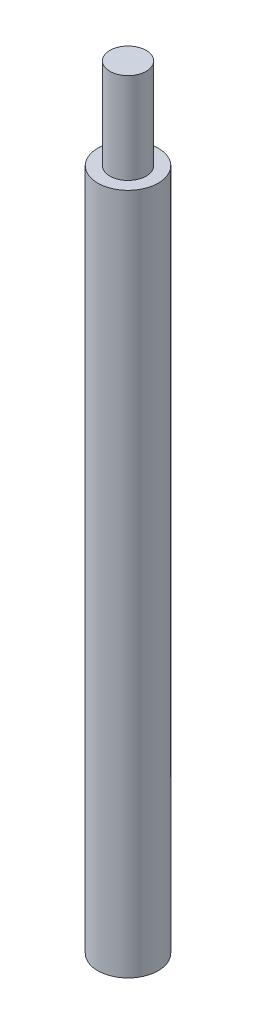
ISO-10303-21;
HEADER;
FILE_DESCRIPTION(('STEP AP214'),'2;1');
FILE_NAME('part.step','',(''),(''),'','','');
FILE_SCHEMA(('AUTOMOTIVE_DESIGN { 1 0 10303 214 1 1 1 1 }'));
ENDSEC;
DATA;
#1=APPLICATION_CONTEXT('core data for automotive mechanical design processes');
#2=APPLICATION_PROTOCOL_DEFINITION('international standard','automotive_design',2000,#1);
#3=PRODUCT_CONTEXT('',#1,'mechanical');
#4=PRODUCT('Part','Part','',(#3));
#5=PRODUCT_RELATED_PRODUCT_CATEGORY('part','',(#4));
#6=PRODUCT_DEFINITION_FORMATION('','',#4);
#7=PRODUCT_DEFINITION_CONTEXT('part definition',#1,'design');
#8=PRODUCT_DEFINITION('design','',#6,#7);
#9=PRODUCT_DEFINITION_SHAPE('','',#8);
#10=(LENGTH_UNIT() NAMED_UNIT(*) SI_UNIT(.MILLI.,.METRE.));
#11=(NAMED_UNIT(*) PLANE_ANGLE_UNIT() SI_UNIT($,.RADIAN.));
#12=(NAMED_UNIT(*) SI_UNIT($,.STERADIAN.) SOLID_ANGLE_UNIT());
#13=UNCERTAINTY_MEASURE_WITH_UNIT(LENGTH_MEASURE(1.E-05),#10,'distance_accuracy_value','');
#14=(GEOMETRIC_REPRESENTATION_CONTEXT(3) GLOBAL_UNCERTAINTY_ASSIGNED_CONTEXT((#13)) GLOBAL_UNIT_ASSIGNED_CONTEXT((#10,
#11,#12)) REPRESENTATION_CONTEXT('',''));
#15=CARTESIAN_POINT('',(0.,0.,0.));
#16=DIRECTION('',(0.,0.,1.));
#17=DIRECTION('',(1.,0.,0.));
#18=AXIS2_PLACEMENT_3D('',#15,#16,#17);
#19=CARTESIAN_POINT('',(0.,225.425,0.));
#20=DIRECTION('',(0.,-1.,0.));
#21=DIRECTION('',(0.,0.,-1.));
#22=AXIS2_PLACEMENT_3D('',#19,#20,#21);
#23=CYLINDRICAL_SURFACE('',#22,10.);
#24=CARTESIAN_POINT('',(0.,225.425,0.));
#25=DIRECTION('',(0.,1.,0.));
#26=DIRECTION('',(0.,0.,1.));
#27=AXIS2_PLACEMENT_3D('',#24,#25,#26);
#28=CIRCLE('',#27,10.);
#29=CARTESIAN_POINT('',(0.,225.425,-10.));
#30=VERTEX_POINT('',#29);
#31=EDGE_CURVE('E10',#30,#30,#28,.T.);
#32=CARTESIAN_POINT('',(0.,0.,0.));
#33=DIRECTION('',(0.,1.,0.));
#34=DIRECTION('',(0.,0.,1.));
#35=AXIS2_PLACEMENT_3D('',#32,#33,#34);
#36=CIRCLE('',#35,10.);
#37=CARTESIAN_POINT('',(0.,0.,-10.));
#38=VERTEX_POINT('',#37);
#39=EDGE_CURVE('E40',#38,#38,#36,.T.);
#40=CARTESIAN_POINT('',(0.,225.425,-10.));
#41=CARTESIAN_POINT('',(0.,223.076822916667,-10.));
#42=CARTESIAN_POINT('',(0.,220.728645833333,-10.));
#43=CARTESIAN_POINT('',(0.,216.032291666667,-10.));
#44=CARTESIAN_POINT('',(0.,213.684114583333,-10.));
#45=CARTESIAN_POINT('',(0.,208.987760416667,-10.));
#46=CARTESIAN_POINT('',(0.,206.639583333333,-10.));
#47=CARTESIAN_POINT('',(0.,201.943229166667,-10.));
#48=CARTESIAN_POINT('',(0.,199.595052083333,-10.));
#49=CARTESIAN_POINT('',(0.,194.898697916667,-10.));
#50=CARTESIAN_POINT('',(0.,192.550520833333,-10.));
#51=CARTESIAN_POINT('',(0.,187.854166666667,-10.));
#52=CARTESIAN_POINT('',(0.,185.505989583333,-10.));
#53=CARTESIAN_POINT('',(0.,180.809635416667,-10.));
#54=CARTESIAN_POINT('',(0.,178.461458333333,-10.));
#55=CARTESIAN_POINT('',(0.,173.765104166667,-10.));
#56=CARTESIAN_POINT('',(0.,171.416927083333,-10.));
#57=CARTESIAN_POINT('',(0.,166.720572916667,-10.));
#58=CARTESIAN_POINT('',(0.,164.372395833333,-10.));
#59=CARTESIAN_POINT('',(0.,159.676041666667,-10.));
#60=CARTESIAN_POINT('',(0.,157.327864583333,-10.));
#61=CARTESIAN_POINT('',(0.,152.631510416667,-10.));
#62=CARTESIAN_POINT('',(0.,150.283333333333,-10.));
#63=CARTESIAN_POINT('',(0.,145.586979166667,-10.));
#64=CARTESIAN_POINT('',(0.,143.238802083333,-10.));
#65=CARTESIAN_POINT('',(0.,138.542447916667,-10.));
#66=CARTESIAN_POINT('',(0.,136.194270833333,-10.));
#67=CARTESIAN_POINT('',(0.,131.497916666667,-10.));
#68=CARTESIAN_POINT('',(0.,129.149739583333,-10.));
#69=CARTESIAN_POINT('',(0.,124.453385416667,-10.));
#70=CARTESIAN_POINT('',(0.,122.105208333333,-10.));
#71=CARTESIAN_POINT('',(0.,117.408854166667,-10.));
#72=CARTESIAN_POINT('',(0.,115.060677083333,-10.));
#73=CARTESIAN_POINT('',(0.,110.364322916667,-10.));
#74=CARTESIAN_POINT('',(0.,108.016145833333,-10.));
#75=CARTESIAN_POINT('',(0.,103.319791666667,-10.));
#76=CARTESIAN_POINT('',(0.,100.971614583333,-10.));
#77=CARTESIAN_POINT('',(0.,96.2752604166666,-10.));
#78=CARTESIAN_POINT('',(0.,93.9270833333333,-10.));
#79=CARTESIAN_POINT('',(0.,89.2307291666666,-10.));
#80=CARTESIAN_POINT('',(0.,86.8825520833333,-10.));
#81=CARTESIAN_POINT('',(0.,82.1861979166666,-10.));
#82=CARTESIAN_POINT('',(0.,79.8380208333333,-10.));
#83=CARTESIAN_POINT('',(0.,75.1416666666667,-10.));
#84=CARTESIAN_POINT('',(0.,72.7934895833333,-10.));
#85=CARTESIAN_POINT('',(0.,68.0971354166666,-10.));
#86=CARTESIAN_POINT('',(0.,65.7489583333333,-10.));
#87=CARTESIAN_POINT('',(0.,61.0526041666666,-10.));
#88=CARTESIAN_POINT('',(0.,58.7044270833333,-10.));
#89=CARTESIAN_POINT('',(0.,54.0080729166666,-10.));
#90=CARTESIAN_POINT('',(0.,51.6598958333333,-10.));
#91=CARTESIAN_POINT('',(0.,46.9635416666666,-10.));
#92=CARTESIAN_POINT('',(0.,44.6153645833333,-10.));
#93=CARTESIAN_POINT('',(0.,39.9190104166666,-10.));
#94=CARTESIAN_POINT('',(0.,37.5708333333333,-10.));
#95=CARTESIAN_POINT('',(0.,32.8744791666666,-10.));
#96=CARTESIAN_POINT('',(0.,30.5263020833333,-10.));
#97=CARTESIAN_POINT('',(0.,25.8299479166666,-10.));
#98=CARTESIAN_POINT('',(0.,23.4817708333333,-10.));
#99=CARTESIAN_POINT('',(0.,18.7854166666666,-10.));
#100=CARTESIAN_POINT('',(0.,16.4372395833333,-10.));
#101=CARTESIAN_POINT('',(0.,11.7408854166666,-10.));
#102=CARTESIAN_POINT('',(0.,9.39270833333332,-10.));
#103=CARTESIAN_POINT('',(0.,4.69635416666665,-10.));
#104=CARTESIAN_POINT('',(0.,2.3481770833333,-10.));
#105=CARTESIAN_POINT('',(0.,0.,-10.));
#106=B_SPLINE_CURVE_WITH_KNOTS('',3,(#40,#41,#42,#43,#44,#45,#46,#47,#48,#49,#50,#51,#52,#53,
#54,#55,#56,#57,#58,#59,#60,#61,#62,#63,#64,#65,#66,#67,#68,#69,#70,#71,#72,#73,#74,#75,#76,#77,
#78,#79,#80,#81,#82,#83,#84,#85,#86,#87,#88,#89,#90,#91,#92,#93,#94,#95,#96,#97,#98,#99,#100,
#101,#102,#103,#104,#105),.UNSPECIFIED.,.F.,.F.,(4,2,2,2,2,2,2,2,2,2,2,2,2,2,2,2,2,2,2,2,2,2,2,
2,2,2,2,2,2,2,2,2,4),(0.,7.04453124999999,14.0890625,21.13359375,28.178125,35.22265625,
42.2671875,49.31171875,56.35625,63.40078125,70.4453125,77.48984375,84.534375,91.57890625,
98.6234375,105.66796875,112.7125,119.75703125,126.8015625,133.84609375,140.890625,147.93515625,
154.9796875,162.02421875,169.06875,176.11328125,183.1578125,190.20234375,197.246875,
204.29140625,211.3359375,218.38046875,225.425),.UNSPECIFIED.);
#107=EDGE_CURVE('BSEAM37',#30,#38,#106,.T.);
#108=ORIENTED_EDGE('',*,*,#31,.F.);
#109=ORIENTED_EDGE('',*,*,#39,.T.);
#110=ORIENTED_EDGE('',*,*,#107,.T.);
#111=ORIENTED_EDGE('',*,*,#107,.F.);
#112=EDGE_LOOP('',(#108,#110,#109,#111));
#113=FACE_BOUND('',#112,.T.);
#114=ADVANCED_FACE('F37',(#113),#23,.T.);
#115=CARTESIAN_POINT('',(0.,225.425,0.));
#116=DIRECTION('',(0.,1.,0.));
#117=DIRECTION('',(0.,0.,1.));
#118=AXIS2_PLACEMENT_3D('',#115,#116,#117);
#119=PLANE('',#118);
#120=CARTESIAN_POINT('',(0.,225.425,0.));
#121=DIRECTION('',(0.,1.,0.));
#122=DIRECTION('',(0.,0.,1.));
#123=AXIS2_PLACEMENT_3D('',#120,#121,#122);
#124=CIRCLE('',#123,6.);
#125=CARTESIAN_POINT('',(0.,225.425,6.));
#126=VERTEX_POINT('',#125);
#127=EDGE_CURVE('E51',#126,#126,#124,.T.);
#128=ORIENTED_EDGE('',*,*,#127,.F.);
#129=EDGE_LOOP('',(#128));
#130=FACE_BOUND('',#129,.T.);
#131=ORIENTED_EDGE('',*,*,#31,.T.);
#132=EDGE_LOOP('',(#131));
#133=FACE_BOUND('',#132,.T.);
#134=ADVANCED_FACE('F67',(#130,#133),#119,.T.);
#135=CARTESIAN_POINT('',(0.,0.,0.));
#136=DIRECTION('',(0.,1.,0.));
#137=DIRECTION('',(0.,0.,1.));
#138=AXIS2_PLACEMENT_3D('',#135,#136,#137);
#139=PLANE('',#138);
#140=ORIENTED_EDGE('',*,*,#39,.F.);
#141=EDGE_LOOP('',(#140));
#142=FACE_BOUND('',#141,.T.);
#143=ADVANCED_FACE('F63',(#142),#139,.F.);
#144=CARTESIAN_POINT('',(0.,255.425,0.));
#145=DIRECTION('',(0.,-1.,0.));
#146=DIRECTION('',(0.,0.,-1.));
#147=AXIS2_PLACEMENT_3D('',#144,#145,#146);
#148=CYLINDRICAL_SURFACE('',#147,6.);
#149=CARTESIAN_POINT('',(0.,255.425,0.));
#150=DIRECTION('',(0.,1.,0.));
#151=DIRECTION('',(0.,0.,1.));
#152=AXIS2_PLACEMENT_3D('',#149,#150,#151);
#153=CIRCLE('',#152,6.);
#154=CARTESIAN_POINT('',(0.,255.425,6.));
#155=VERTEX_POINT('',#154);
#156=EDGE_CURVE('E49',#155,#155,#153,.T.);
#157=ORIENTED_EDGE('',*,*,#156,.F.);
#158=EDGE_LOOP('',(#157));
#159=FACE_BOUND('',#158,.T.);
#160=ORIENTED_EDGE('',*,*,#127,.T.);
#161=EDGE_LOOP('',(#160));
#162=FACE_BOUND('',#161,.T.);
#163=ADVANCED_FACE('F60',(#159,#162),#148,.T.);
#164=CARTESIAN_POINT('',(0.,255.425,0.));
#165=DIRECTION('',(0.,1.,0.));
#166=DIRECTION('',(0.,0.,1.));
#167=AXIS2_PLACEMENT_3D('',#164,#165,#166);
#168=PLANE('',#167);
#169=ORIENTED_EDGE('',*,*,#156,.T.);
#170=EDGE_LOOP('',(#169));
#171=FACE_BOUND('',#170,.T.);
#172=ADVANCED_FACE('F58',(#171),#168,.T.);
#173=CLOSED_SHELL('',(#114,#134,#143,#163,#172));
#174=MANIFOLD_SOLID_BREP('B2',#173);
#175=ADVANCED_BREP_SHAPE_REPRESENTATION('',(#18,#174),#14);
#176=SHAPE_DEFINITION_REPRESENTATION(#9,#175);
ENDSEC;
END-ISO-10303-21;
